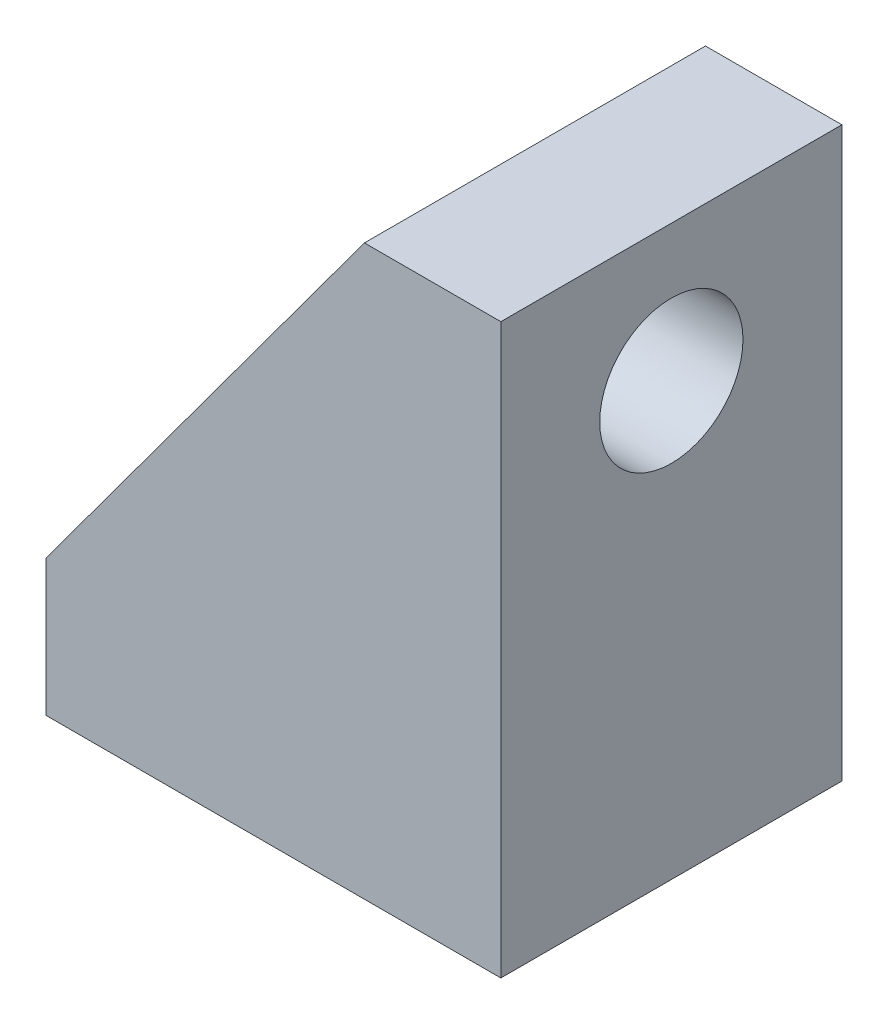
ISO-10303-21;
HEADER;
FILE_DESCRIPTION(('STEP AP214'),'2;1');
FILE_NAME('part.step','',(''),(''),'','','');
FILE_SCHEMA(('AUTOMOTIVE_DESIGN { 1 0 10303 214 1 1 1 1 }'));
ENDSEC;
DATA;
#1=APPLICATION_CONTEXT('core data for automotive mechanical design processes');
#2=APPLICATION_PROTOCOL_DEFINITION('international standard','automotive_design',2000,#1);
#3=PRODUCT_CONTEXT('',#1,'mechanical');
#4=PRODUCT('Part','Part','',(#3));
#5=PRODUCT_RELATED_PRODUCT_CATEGORY('part','',(#4));
#6=PRODUCT_DEFINITION_FORMATION('','',#4);
#7=PRODUCT_DEFINITION_CONTEXT('part definition',#1,'design');
#8=PRODUCT_DEFINITION('design','',#6,#7);
#9=PRODUCT_DEFINITION_SHAPE('','',#8);
#10=(LENGTH_UNIT() NAMED_UNIT(*) SI_UNIT(.MILLI.,.METRE.));
#11=(NAMED_UNIT(*) PLANE_ANGLE_UNIT() SI_UNIT($,.RADIAN.));
#12=(NAMED_UNIT(*) SI_UNIT($,.STERADIAN.) SOLID_ANGLE_UNIT());
#13=UNCERTAINTY_MEASURE_WITH_UNIT(LENGTH_MEASURE(1.E-05),#10,'distance_accuracy_value','');
#14=(GEOMETRIC_REPRESENTATION_CONTEXT(3) GLOBAL_UNCERTAINTY_ASSIGNED_CONTEXT((#13)) GLOBAL_UNIT_ASSIGNED_CONTEXT((#10,
#11,#12)) REPRESENTATION_CONTEXT('',''));
#15=CARTESIAN_POINT('',(0.,0.,0.));
#16=DIRECTION('',(0.,0.,1.));
#17=DIRECTION('',(1.,0.,0.));
#18=AXIS2_PLACEMENT_3D('',#15,#16,#17);
#19=CARTESIAN_POINT('',(25.2704015300547,6.,7.5));
#20=DIRECTION('',(0.,1.,0.));
#21=DIRECTION('',(0.,0.,1.));
#22=AXIS2_PLACEMENT_3D('',#19,#20,#21);
#23=CYLINDRICAL_SURFACE('',#22,5.5);
#24=CARTESIAN_POINT('',(25.2704015300547,6.,7.5));
#25=DIRECTION('',(0.,1.,0.));
#26=DIRECTION('',(0.,0.,1.));
#27=AXIS2_PLACEMENT_3D('',#24,#25,#26);
#28=CIRCLE('',#27,5.5);
#29=CARTESIAN_POINT('',(25.2704015300547,6.,13.));
#30=VERTEX_POINT('',#29);
#31=EDGE_CURVE('E224',#30,#30,#28,.T.);
#32=ORIENTED_EDGE('',*,*,#31,.F.);
#33=EDGE_LOOP('',(#32));
#34=FACE_BOUND('',#33,.T.);
#35=CARTESIAN_POINT('',(25.2704015300547,19.,7.5));
#36=DIRECTION('',(0.707106781186547,0.707106781186547,0.));
#37=DIRECTION('',(-0.707106781186547,0.707106781186547,0.));
#38=AXIS2_PLACEMENT_3D('',#35,#36,#37);
#39=ELLIPSE('',#38,7.77817459305202,5.5);
#40=CARTESIAN_POINT('',(26.7992609239941,17.4711406060606,2.21676340170504));
#41=VERTEX_POINT('',#40);
#42=CARTESIAN_POINT('',(26.7992609239941,17.4711406060606,12.783236598295));
#43=VERTEX_POINT('',#42);
#44=EDGE_CURVE('E62',#41,#43,#39,.F.);
#45=ORIENTED_EDGE('',*,*,#44,.F.);
#46=CARTESIAN_POINT('',(25.2704015300547,15.39626,7.5));
#47=DIRECTION('',(-0.805055837353368,0.59319903804985,0.));
#48=DIRECTION('',(0.59319903804985,0.805055837353368,0.));
#49=AXIS2_PLACEMENT_3D('',#46,#47,#48);
#50=ELLIPSE('',#49,9.27176149523324,5.5);
#51=EDGE_CURVE('E56',#41,#43,#50,.T.);
#52=ORIENTED_EDGE('',*,*,#51,.T.);
#53=EDGE_LOOP('',(#45,#52));
#54=FACE_BOUND('',#53,.T.);
#55=ADVANCED_FACE('F47',(#34,#54),#23,.F.);
#56=CARTESIAN_POINT('',(9.02551129685772,-6.65037674505306,15.));
#57=DIRECTION('',(-0.805055837353368,0.59319903804985,0.));
#58=DIRECTION('',(-0.59319903804985,-0.805055837353368,0.));
#59=AXIS2_PLACEMENT_3D('',#56,#57,#58);
#60=PLANE('',#59);
#61=DIRECTION('',(0.59319903804985,0.805055837353368,0.));
#62=VECTOR('',#61,1.);
#63=CARTESIAN_POINT('',(9.02551129685772,-6.65037674505306,0.));
#64=LINE('',#63,#62);
#65=CARTESIAN_POINT('',(18.3468415300547,6.,0.));
#66=VERTEX_POINT('',#65);
#67=CARTESIAN_POINT('',(32.3468415300547,25.,0.));
#68=VERTEX_POINT('',#67);
#69=EDGE_CURVE('E136',#66,#68,#64,.T.);
#70=ORIENTED_EDGE('',*,*,#69,.F.);
#71=DIRECTION('',(0.,0.,-1.));
#72=VECTOR('',#71,1.);
#73=CARTESIAN_POINT('',(18.3468415300547,6.,15.));
#74=LINE('',#73,#72);
#75=CARTESIAN_POINT('',(18.3468415300547,6.,15.));
#76=VERTEX_POINT('',#75);
#77=EDGE_CURVE('E99',#76,#66,#74,.T.);
#78=ORIENTED_EDGE('',*,*,#77,.F.);
#79=DIRECTION('',(0.59319903804985,0.805055837353368,0.));
#80=VECTOR('',#79,1.);
#81=CARTESIAN_POINT('',(9.02551129685772,-6.65037674505306,15.));
#82=LINE('',#81,#80);
#83=CARTESIAN_POINT('',(32.3468415300547,25.,15.));
#84=VERTEX_POINT('',#83);
#85=EDGE_CURVE('E153',#76,#84,#82,.T.);
#86=ORIENTED_EDGE('',*,*,#85,.T.);
#87=DIRECTION('',(0.,0.,-1.));
#88=VECTOR('',#87,1.);
#89=CARTESIAN_POINT('',(32.3468415300547,25.,15.));
#90=LINE('',#89,#88);
#91=EDGE_CURVE('E94',#84,#68,#90,.T.);
#92=ORIENTED_EDGE('',*,*,#91,.T.);
#93=EDGE_LOOP('',(#70,#78,#86,#92));
#94=FACE_BOUND('',#93,.T.);
#95=ORIENTED_EDGE('',*,*,#51,.F.);
#96=CARTESIAN_POINT('',(27.9257888984758,19.,7.49999999999999));
#97=DIRECTION('',(-0.805055837353368,0.59319903804985,0.));
#98=DIRECTION('',(-0.59319903804985,-0.805055837353368,0.));
#99=AXIS2_PLACEMENT_3D('',#96,#97,#98);
#100=ELLIPSE('',#99,6.83182425964555,5.5);
#101=EDGE_CURVE('E12',#41,#43,#100,.F.);
#102=ORIENTED_EDGE('',*,*,#101,.T.);
#103=EDGE_LOOP('',(#95,#102));
#104=FACE_BOUND('',#103,.T.);
#105=ADVANCED_FACE('F49',(#94,#104),#60,.T.);
#106=CARTESIAN_POINT('',(38.3468415300547,19.,7.49999999999999));
#107=DIRECTION('',(-1.,0.,0.));
#108=DIRECTION('',(0.,0.,1.));
#109=AXIS2_PLACEMENT_3D('',#106,#107,#108);
#110=CYLINDRICAL_SURFACE('',#109,3.15);
#111=CARTESIAN_POINT('',(38.3468415300547,19.,7.49999999999999));
#112=DIRECTION('',(1.,0.,0.));
#113=DIRECTION('',(0.,0.,-1.));
#114=AXIS2_PLACEMENT_3D('',#111,#112,#113);
#115=CIRCLE('',#114,3.15);
#116=CARTESIAN_POINT('',(38.3468415300547,19.,4.34999999999999));
#117=VERTEX_POINT('',#116);
#118=EDGE_CURVE('E232',#117,#117,#115,.T.);
#119=ORIENTED_EDGE('',*,*,#118,.T.);
#120=EDGE_LOOP('',(#119));
#121=FACE_BOUND('',#120,.T.);
#122=CARTESIAN_POINT('',(32.3468415300547,19.,7.49999999999999));
#123=DIRECTION('',(-1.,0.,0.));
#124=DIRECTION('',(0.,0.,1.));
#125=AXIS2_PLACEMENT_3D('',#122,#123,#124);
#126=CIRCLE('',#125,3.15);
#127=CARTESIAN_POINT('',(32.3468415300547,19.,10.65));
#128=VERTEX_POINT('',#127);
#129=EDGE_CURVE('E238',#128,#128,#126,.T.);
#130=ORIENTED_EDGE('',*,*,#129,.T.);
#131=EDGE_LOOP('',(#130));
#132=FACE_BOUND('',#131,.T.);
#133=ADVANCED_FACE('F188',(#121,#132),#110,.F.);
#134=CARTESIAN_POINT('',(25.2704015300547,0.,7.5));
#135=DIRECTION('',(0.,1.,0.));
#136=DIRECTION('',(0.,0.,1.));
#137=AXIS2_PLACEMENT_3D('',#134,#135,#136);
#138=CYLINDRICAL_SURFACE('',#137,3.15);
#139=CARTESIAN_POINT('',(25.2704015300547,0.,7.5));
#140=DIRECTION('',(0.,1.,0.));
#141=DIRECTION('',(0.,0.,1.));
#142=AXIS2_PLACEMENT_3D('',#139,#140,#141);
#143=CIRCLE('',#142,3.15);
#144=CARTESIAN_POINT('',(25.2704015300547,0.,10.65));
#145=VERTEX_POINT('',#144);
#146=EDGE_CURVE('E141',#145,#145,#143,.T.);
#147=ORIENTED_EDGE('',*,*,#146,.F.);
#148=EDGE_LOOP('',(#147));
#149=FACE_BOUND('',#148,.T.);
#150=CARTESIAN_POINT('',(25.2704015300547,6.,7.5));
#151=DIRECTION('',(0.,1.,0.));
#152=DIRECTION('',(0.,0.,1.));
#153=AXIS2_PLACEMENT_3D('',#150,#151,#152);
#154=CIRCLE('',#153,3.15);
#155=CARTESIAN_POINT('',(25.2704015300547,6.,10.65));
#156=VERTEX_POINT('',#155);
#157=EDGE_CURVE('E228',#156,#156,#154,.T.);
#158=ORIENTED_EDGE('',*,*,#157,.T.);
#159=EDGE_LOOP('',(#158));
#160=FACE_BOUND('',#159,.T.);
#161=ADVANCED_FACE('F192',(#149,#160),#138,.F.);
#162=CARTESIAN_POINT('',(18.3468415300547,0.,15.));
#163=DIRECTION('',(-1.,0.,0.));
#164=DIRECTION('',(0.,0.,1.));
#165=AXIS2_PLACEMENT_3D('',#162,#163,#164);
#166=PLANE('',#165);
#167=DIRECTION('',(0.,1.,0.));
#168=VECTOR('',#167,1.);
#169=CARTESIAN_POINT('',(18.3468415300547,0.,0.));
#170=LINE('',#169,#168);
#171=CARTESIAN_POINT('',(18.3468415300547,0.,0.));
#172=VERTEX_POINT('',#171);
#173=EDGE_CURVE('E140',#172,#66,#170,.T.);
#174=ORIENTED_EDGE('',*,*,#173,.F.);
#175=DIRECTION('',(0.,0.,-1.));
#176=VECTOR('',#175,1.);
#177=CARTESIAN_POINT('',(18.3468415300547,0.,15.));
#178=LINE('',#177,#176);
#179=CARTESIAN_POINT('',(18.3468415300547,0.,15.));
#180=VERTEX_POINT('',#179);
#181=EDGE_CURVE('E125',#180,#172,#178,.T.);
#182=ORIENTED_EDGE('',*,*,#181,.F.);
#183=DIRECTION('',(0.,1.,0.));
#184=VECTOR('',#183,1.);
#185=CARTESIAN_POINT('',(18.3468415300547,0.,15.));
#186=LINE('',#185,#184);
#187=EDGE_CURVE('E113',#180,#76,#186,.T.);
#188=ORIENTED_EDGE('',*,*,#187,.T.);
#189=ORIENTED_EDGE('',*,*,#77,.T.);
#190=EDGE_LOOP('',(#174,#182,#188,#189));
#191=FACE_BOUND('',#190,.T.);
#192=ADVANCED_FACE('F195',(#191),#166,.T.);
#193=CARTESIAN_POINT('',(0.,0.,15.));
#194=DIRECTION('',(0.,1.,0.));
#195=DIRECTION('',(0.,0.,1.));
#196=AXIS2_PLACEMENT_3D('',#193,#194,#195);
#197=PLANE('',#196);
#198=ORIENTED_EDGE('',*,*,#146,.T.);
#199=EDGE_LOOP('',(#198));
#200=FACE_BOUND('',#199,.T.);
#201=DIRECTION('',(1.,0.,0.));
#202=VECTOR('',#201,1.);
#203=CARTESIAN_POINT('',(0.,0.,0.));
#204=LINE('',#203,#202);
#205=CARTESIAN_POINT('',(38.3468415300547,0.,0.));
#206=VERTEX_POINT('',#205);
#207=EDGE_CURVE('E121',#172,#206,#204,.T.);
#208=ORIENTED_EDGE('',*,*,#207,.T.);
#209=DIRECTION('',(0.,0.,-1.));
#210=VECTOR('',#209,1.);
#211=CARTESIAN_POINT('',(38.3468415300547,0.,15.));
#212=LINE('',#211,#210);
#213=CARTESIAN_POINT('',(38.3468415300547,0.,15.));
#214=VERTEX_POINT('',#213);
#215=EDGE_CURVE('E118',#214,#206,#212,.T.);
#216=ORIENTED_EDGE('',*,*,#215,.F.);
#217=DIRECTION('',(1.,0.,0.));
#218=VECTOR('',#217,1.);
#219=CARTESIAN_POINT('',(0.,0.,15.));
#220=LINE('',#219,#218);
#221=EDGE_CURVE('E106',#180,#214,#220,.T.);
#222=ORIENTED_EDGE('',*,*,#221,.F.);
#223=ORIENTED_EDGE('',*,*,#181,.T.);
#224=EDGE_LOOP('',(#208,#216,#222,#223));
#225=FACE_BOUND('',#224,.T.);
#226=ADVANCED_FACE('F119',(#200,#225),#197,.F.);
#227=CARTESIAN_POINT('',(38.3468415300547,0.,15.));
#228=DIRECTION('',(-1.,0.,0.));
#229=DIRECTION('',(0.,0.,1.));
#230=AXIS2_PLACEMENT_3D('',#227,#228,#229);
#231=PLANE('',#230);
#232=ORIENTED_EDGE('',*,*,#118,.F.);
#233=EDGE_LOOP('',(#232));
#234=FACE_BOUND('',#233,.T.);
#235=DIRECTION('',(0.,1.,0.));
#236=VECTOR('',#235,1.);
#237=CARTESIAN_POINT('',(38.3468415300547,0.,0.));
#238=LINE('',#237,#236);
#239=CARTESIAN_POINT('',(38.3468415300547,25.,0.));
#240=VERTEX_POINT('',#239);
#241=EDGE_CURVE('E147',#206,#240,#238,.T.);
#242=ORIENTED_EDGE('',*,*,#241,.T.);
#243=DIRECTION('',(0.,0.,-1.));
#244=VECTOR('',#243,1.);
#245=CARTESIAN_POINT('',(38.3468415300547,25.,15.));
#246=LINE('',#245,#244);
#247=CARTESIAN_POINT('',(38.3468415300547,25.,15.));
#248=VERTEX_POINT('',#247);
#249=EDGE_CURVE('E126',#248,#240,#246,.T.);
#250=ORIENTED_EDGE('',*,*,#249,.F.);
#251=DIRECTION('',(0.,1.,0.));
#252=VECTOR('',#251,1.);
#253=CARTESIAN_POINT('',(38.3468415300547,0.,15.));
#254=LINE('',#253,#252);
#255=EDGE_CURVE('E110',#214,#248,#254,.T.);
#256=ORIENTED_EDGE('',*,*,#255,.F.);
#257=ORIENTED_EDGE('',*,*,#215,.T.);
#258=EDGE_LOOP('',(#242,#250,#256,#257));
#259=FACE_BOUND('',#258,.T.);
#260=ADVANCED_FACE('F128',(#234,#259),#231,.F.);
#261=CARTESIAN_POINT('',(0.,25.,15.));
#262=DIRECTION('',(0.,-1.,0.));
#263=DIRECTION('',(0.,0.,-1.));
#264=AXIS2_PLACEMENT_3D('',#261,#262,#263);
#265=PLANE('',#264);
#266=DIRECTION('',(-1.,0.,0.));
#267=VECTOR('',#266,1.);
#268=CARTESIAN_POINT('',(0.,25.,0.));
#269=LINE('',#268,#267);
#270=EDGE_CURVE('E150',#240,#68,#269,.T.);
#271=ORIENTED_EDGE('',*,*,#270,.T.);
#272=ORIENTED_EDGE('',*,*,#91,.F.);
#273=DIRECTION('',(-1.,0.,0.));
#274=VECTOR('',#273,1.);
#275=CARTESIAN_POINT('',(0.,25.,15.));
#276=LINE('',#275,#274);
#277=EDGE_CURVE('E70',#248,#84,#276,.T.);
#278=ORIENTED_EDGE('',*,*,#277,.F.);
#279=ORIENTED_EDGE('',*,*,#249,.T.);
#280=EDGE_LOOP('',(#271,#272,#278,#279));
#281=FACE_BOUND('',#280,.T.);
#282=ADVANCED_FACE('F199',(#281),#265,.F.);
#283=CARTESIAN_POINT('',(0.,0.,15.));
#284=DIRECTION('',(0.,0.,1.));
#285=DIRECTION('',(1.,0.,0.));
#286=AXIS2_PLACEMENT_3D('',#283,#284,#285);
#287=PLANE('',#286);
#288=ORIENTED_EDGE('',*,*,#85,.F.);
#289=ORIENTED_EDGE('',*,*,#187,.F.);
#290=ORIENTED_EDGE('',*,*,#221,.T.);
#291=ORIENTED_EDGE('',*,*,#255,.T.);
#292=ORIENTED_EDGE('',*,*,#277,.T.);
#293=EDGE_LOOP('',(#288,#289,#290,#291,#292));
#294=FACE_BOUND('',#293,.T.);
#295=ADVANCED_FACE('F108',(#294),#287,.T.);
#296=CARTESIAN_POINT('',(0.,0.,0.));
#297=DIRECTION('',(0.,0.,1.));
#298=DIRECTION('',(1.,0.,0.));
#299=AXIS2_PLACEMENT_3D('',#296,#297,#298);
#300=PLANE('',#299);
#301=ORIENTED_EDGE('',*,*,#69,.T.);
#302=ORIENTED_EDGE('',*,*,#270,.F.);
#303=ORIENTED_EDGE('',*,*,#241,.F.);
#304=ORIENTED_EDGE('',*,*,#207,.F.);
#305=ORIENTED_EDGE('',*,*,#173,.T.);
#306=EDGE_LOOP('',(#301,#302,#303,#304,#305));
#307=FACE_BOUND('',#306,.T.);
#308=ADVANCED_FACE('F178',(#307),#300,.F.);
#309=CARTESIAN_POINT('',(25.2704015300547,6.,7.5));
#310=DIRECTION('',(0.,1.,0.));
#311=DIRECTION('',(0.,0.,1.));
#312=AXIS2_PLACEMENT_3D('',#309,#310,#311);
#313=PLANE('',#312);
#314=ORIENTED_EDGE('',*,*,#157,.F.);
#315=EDGE_LOOP('',(#314));
#316=FACE_BOUND('',#315,.T.);
#317=ORIENTED_EDGE('',*,*,#31,.T.);
#318=EDGE_LOOP('',(#317));
#319=FACE_BOUND('',#318,.T.);
#320=ADVANCED_FACE('F169',(#316,#319),#313,.T.);
#321=CARTESIAN_POINT('',(53.9031907161588,19.,7.49999999999999));
#322=DIRECTION('',(-1.,0.,0.));
#323=DIRECTION('',(0.,0.,1.));
#324=AXIS2_PLACEMENT_3D('',#321,#322,#323);
#325=CYLINDRICAL_SURFACE('',#324,5.5);
#326=CARTESIAN_POINT('',(32.3468415300547,19.,7.49999999999999));
#327=DIRECTION('',(-1.,0.,0.));
#328=DIRECTION('',(0.,0.,1.));
#329=AXIS2_PLACEMENT_3D('',#326,#327,#328);
#330=CIRCLE('',#329,5.5);
#331=CARTESIAN_POINT('',(32.3468415300547,19.,13.));
#332=VERTEX_POINT('',#331);
#333=EDGE_CURVE('E242',#332,#332,#330,.T.);
#334=ORIENTED_EDGE('',*,*,#333,.F.);
#335=EDGE_LOOP('',(#334));
#336=FACE_BOUND('',#335,.T.);
#337=ORIENTED_EDGE('',*,*,#44,.T.);
#338=ORIENTED_EDGE('',*,*,#101,.F.);
#339=EDGE_LOOP('',(#337,#338));
#340=FACE_BOUND('',#339,.T.);
#341=ADVANCED_FACE('F166',(#336,#340),#325,.F.);
#342=CARTESIAN_POINT('',(32.3468415300547,0.,15.));
#343=DIRECTION('',(-1.,0.,0.));
#344=DIRECTION('',(0.,0.,1.));
#345=AXIS2_PLACEMENT_3D('',#342,#343,#344);
#346=PLANE('',#345);
#347=ORIENTED_EDGE('',*,*,#129,.F.);
#348=EDGE_LOOP('',(#347));
#349=FACE_BOUND('',#348,.T.);
#350=ORIENTED_EDGE('',*,*,#333,.T.);
#351=EDGE_LOOP('',(#350));
#352=FACE_BOUND('',#351,.T.);
#353=ADVANCED_FACE('F168',(#349,#352),#346,.T.);
#354=CLOSED_SHELL('',(#55,#105,#133,#161,#192,#226,#260,#282,#295,#308,#320,#341,#353));
#355=MANIFOLD_SOLID_BREP('B2',#354);
#356=ADVANCED_BREP_SHAPE_REPRESENTATION('',(#18,#355),#14);
#357=SHAPE_DEFINITION_REPRESENTATION(#9,#356);
ENDSEC;
END-ISO-10303-21;
